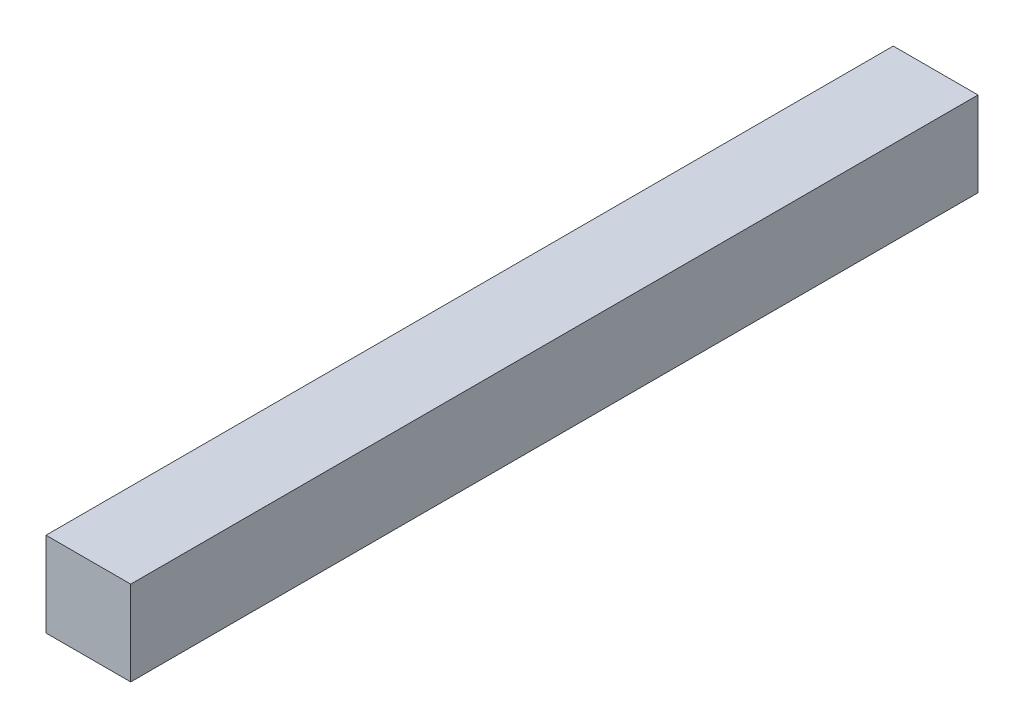
ISO-10303-21;
HEADER;
FILE_DESCRIPTION(('STEP AP214'),'2;1');
FILE_NAME('part.step','',(''),(''),'','','');
FILE_SCHEMA(('AUTOMOTIVE_DESIGN { 1 0 10303 214 1 1 1 1 }'));
ENDSEC;
DATA;
#1=APPLICATION_CONTEXT('core data for automotive mechanical design processes');
#2=APPLICATION_PROTOCOL_DEFINITION('international standard','automotive_design',2000,#1);
#3=PRODUCT_CONTEXT('',#1,'mechanical');
#4=PRODUCT('Part','Part','',(#3));
#5=PRODUCT_RELATED_PRODUCT_CATEGORY('part','',(#4));
#6=PRODUCT_DEFINITION_FORMATION('','',#4);
#7=PRODUCT_DEFINITION_CONTEXT('part definition',#1,'design');
#8=PRODUCT_DEFINITION('design','',#6,#7);
#9=PRODUCT_DEFINITION_SHAPE('','',#8);
#10=(LENGTH_UNIT() NAMED_UNIT(*) SI_UNIT(.MILLI.,.METRE.));
#11=(NAMED_UNIT(*) PLANE_ANGLE_UNIT() SI_UNIT($,.RADIAN.));
#12=(NAMED_UNIT(*) SI_UNIT($,.STERADIAN.) SOLID_ANGLE_UNIT());
#13=UNCERTAINTY_MEASURE_WITH_UNIT(LENGTH_MEASURE(1.E-05),#10,'distance_accuracy_value','');
#14=(GEOMETRIC_REPRESENTATION_CONTEXT(3) GLOBAL_UNCERTAINTY_ASSIGNED_CONTEXT((#13)) GLOBAL_UNIT_ASSIGNED_CONTEXT((#10,
#11,#12)) REPRESENTATION_CONTEXT('',''));
#15=CARTESIAN_POINT('',(0.,0.,0.));
#16=DIRECTION('',(0.,0.,1.));
#17=DIRECTION('',(1.,0.,0.));
#18=AXIS2_PLACEMENT_3D('',#15,#16,#17);
#19=CARTESIAN_POINT('',(0.,0.,200.));
#20=DIRECTION('',(1.,0.,0.));
#21=DIRECTION('',(0.,0.,-1.));
#22=AXIS2_PLACEMENT_3D('',#19,#20,#21);
#23=PLANE('',#22);
#24=DIRECTION('',(0.,-1.,0.));
#25=VECTOR('',#24,1.);
#26=CARTESIAN_POINT('',(0.,0.,0.));
#27=LINE('',#26,#25);
#28=CARTESIAN_POINT('',(0.,0.,0.));
#29=VERTEX_POINT('',#28);
#30=CARTESIAN_POINT('',(0.,-20.,0.));
#31=VERTEX_POINT('',#30);
#32=EDGE_CURVE('E96',#29,#31,#27,.T.);
#33=ORIENTED_EDGE('',*,*,#32,.T.);
#34=DIRECTION('',(0.,0.,-1.));
#35=VECTOR('',#34,1.);
#36=CARTESIAN_POINT('',(0.,-20.,200.));
#37=LINE('',#36,#35);
#38=CARTESIAN_POINT('',(0.,-20.,200.));
#39=VERTEX_POINT('',#38);
#40=EDGE_CURVE('E11',#39,#31,#37,.T.);
#41=ORIENTED_EDGE('',*,*,#40,.F.);
#42=DIRECTION('',(0.,-1.,0.));
#43=VECTOR('',#42,1.);
#44=CARTESIAN_POINT('',(0.,0.,200.));
#45=LINE('',#44,#43);
#46=CARTESIAN_POINT('',(0.,0.,200.));
#47=VERTEX_POINT('',#46);
#48=EDGE_CURVE('E84',#47,#39,#45,.T.);
#49=ORIENTED_EDGE('',*,*,#48,.F.);
#50=DIRECTION('',(0.,0.,-1.));
#51=VECTOR('',#50,1.);
#52=CARTESIAN_POINT('',(0.,0.,200.));
#53=LINE('',#52,#51);
#54=EDGE_CURVE('E92',#47,#29,#53,.T.);
#55=ORIENTED_EDGE('',*,*,#54,.T.);
#56=EDGE_LOOP('',(#33,#41,#49,#55));
#57=FACE_BOUND('',#56,.T.);
#58=ADVANCED_FACE('F33',(#57),#23,.F.);
#59=CARTESIAN_POINT('',(0.,-20.,200.));
#60=DIRECTION('',(0.,1.,0.));
#61=DIRECTION('',(0.,0.,1.));
#62=AXIS2_PLACEMENT_3D('',#59,#60,#61);
#63=PLANE('',#62);
#64=DIRECTION('',(1.,0.,0.));
#65=VECTOR('',#64,1.);
#66=CARTESIAN_POINT('',(0.,-20.,0.));
#67=LINE('',#66,#65);
#68=CARTESIAN_POINT('',(20.,-20.,0.));
#69=VERTEX_POINT('',#68);
#70=EDGE_CURVE('E88',#31,#69,#67,.T.);
#71=ORIENTED_EDGE('',*,*,#70,.T.);
#72=DIRECTION('',(0.,0.,-1.));
#73=VECTOR('',#72,1.);
#74=CARTESIAN_POINT('',(20.,-20.,200.));
#75=LINE('',#74,#73);
#76=CARTESIAN_POINT('',(20.,-20.,200.));
#77=VERTEX_POINT('',#76);
#78=EDGE_CURVE('E41',#77,#69,#75,.T.);
#79=ORIENTED_EDGE('',*,*,#78,.F.);
#80=DIRECTION('',(1.,0.,0.));
#81=VECTOR('',#80,1.);
#82=CARTESIAN_POINT('',(0.,-20.,200.));
#83=LINE('',#82,#81);
#84=EDGE_CURVE('E79',#39,#77,#83,.T.);
#85=ORIENTED_EDGE('',*,*,#84,.F.);
#86=ORIENTED_EDGE('',*,*,#40,.T.);
#87=EDGE_LOOP('',(#71,#79,#85,#86));
#88=FACE_BOUND('',#87,.T.);
#89=ADVANCED_FACE('F87',(#88),#63,.F.);
#90=CARTESIAN_POINT('',(20.,0.,200.));
#91=DIRECTION('',(-1.,0.,0.));
#92=DIRECTION('',(0.,-1.,0.));
#93=AXIS2_PLACEMENT_3D('',#90,#91,#92);
#94=PLANE('',#93);
#95=DIRECTION('',(0.,1.,0.));
#96=VECTOR('',#95,1.);
#97=CARTESIAN_POINT('',(20.,0.,0.));
#98=LINE('',#97,#96);
#99=CARTESIAN_POINT('',(20.,0.,0.));
#100=VERTEX_POINT('',#99);
#101=EDGE_CURVE('E66',#69,#100,#98,.T.);
#102=ORIENTED_EDGE('',*,*,#101,.T.);
#103=DIRECTION('',(0.,0.,-1.));
#104=VECTOR('',#103,1.);
#105=CARTESIAN_POINT('',(20.,0.,200.));
#106=LINE('',#105,#104);
#107=CARTESIAN_POINT('',(20.,0.,200.));
#108=VERTEX_POINT('',#107);
#109=EDGE_CURVE('E89',#108,#100,#106,.T.);
#110=ORIENTED_EDGE('',*,*,#109,.F.);
#111=DIRECTION('',(0.,1.,0.));
#112=VECTOR('',#111,1.);
#113=CARTESIAN_POINT('',(20.,0.,200.));
#114=LINE('',#113,#112);
#115=EDGE_CURVE('E82',#77,#108,#114,.T.);
#116=ORIENTED_EDGE('',*,*,#115,.F.);
#117=ORIENTED_EDGE('',*,*,#78,.T.);
#118=EDGE_LOOP('',(#102,#110,#116,#117));
#119=FACE_BOUND('',#118,.T.);
#120=ADVANCED_FACE('F90',(#119),#94,.F.);
#121=CARTESIAN_POINT('',(0.,0.,200.));
#122=DIRECTION('',(0.,-1.,0.));
#123=DIRECTION('',(0.,0.,-1.));
#124=AXIS2_PLACEMENT_3D('',#121,#122,#123);
#125=PLANE('',#124);
#126=DIRECTION('',(-1.,0.,0.));
#127=VECTOR('',#126,1.);
#128=CARTESIAN_POINT('',(0.,0.,0.));
#129=LINE('',#128,#127);
#130=EDGE_CURVE('E72',#100,#29,#129,.T.);
#131=ORIENTED_EDGE('',*,*,#130,.T.);
#132=ORIENTED_EDGE('',*,*,#54,.F.);
#133=DIRECTION('',(-1.,0.,0.));
#134=VECTOR('',#133,1.);
#135=CARTESIAN_POINT('',(0.,0.,200.));
#136=LINE('',#135,#134);
#137=EDGE_CURVE('E49',#108,#47,#136,.T.);
#138=ORIENTED_EDGE('',*,*,#137,.F.);
#139=ORIENTED_EDGE('',*,*,#109,.T.);
#140=EDGE_LOOP('',(#131,#132,#138,#139));
#141=FACE_BOUND('',#140,.T.);
#142=ADVANCED_FACE('F103',(#141),#125,.F.);
#143=CARTESIAN_POINT('',(0.,0.,200.));
#144=DIRECTION('',(0.,0.,1.));
#145=DIRECTION('',(1.,0.,0.));
#146=AXIS2_PLACEMENT_3D('',#143,#144,#145);
#147=PLANE('',#146);
#148=ORIENTED_EDGE('',*,*,#48,.T.);
#149=ORIENTED_EDGE('',*,*,#84,.T.);
#150=ORIENTED_EDGE('',*,*,#115,.T.);
#151=ORIENTED_EDGE('',*,*,#137,.T.);
#152=EDGE_LOOP('',(#148,#149,#150,#151));
#153=FACE_BOUND('',#152,.T.);
#154=ADVANCED_FACE('F80',(#153),#147,.T.);
#155=CARTESIAN_POINT('',(0.,0.,0.));
#156=DIRECTION('',(0.,0.,1.));
#157=DIRECTION('',(1.,0.,0.));
#158=AXIS2_PLACEMENT_3D('',#155,#156,#157);
#159=PLANE('',#158);
#160=ORIENTED_EDGE('',*,*,#32,.F.);
#161=ORIENTED_EDGE('',*,*,#130,.F.);
#162=ORIENTED_EDGE('',*,*,#101,.F.);
#163=ORIENTED_EDGE('',*,*,#70,.F.);
#164=EDGE_LOOP('',(#160,#161,#162,#163));
#165=FACE_BOUND('',#164,.T.);
#166=ADVANCED_FACE('F106',(#165),#159,.F.);
#167=CLOSED_SHELL('',(#58,#89,#120,#142,#154,#166));
#168=MANIFOLD_SOLID_BREP('B2',#167);
#169=ADVANCED_BREP_SHAPE_REPRESENTATION('',(#18,#168),#14);
#170=SHAPE_DEFINITION_REPRESENTATION(#9,#169);
ENDSEC;
END-ISO-10303-21;
